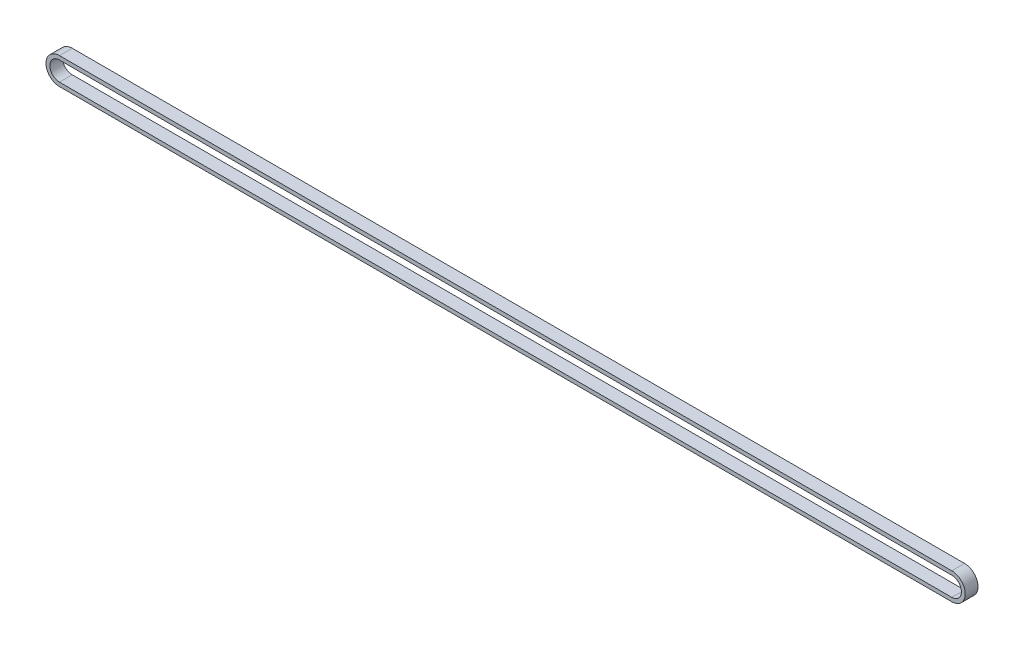
ISO-10303-21;
HEADER;
FILE_DESCRIPTION(('STEP AP214'),'2;1');
FILE_NAME('part.step','',(''),(''),'','','');
FILE_SCHEMA(('AUTOMOTIVE_DESIGN { 1 0 10303 214 1 1 1 1 }'));
ENDSEC;
DATA;
#1=APPLICATION_CONTEXT('core data for automotive mechanical design processes');
#2=APPLICATION_PROTOCOL_DEFINITION('international standard','automotive_design',2000,#1);
#3=PRODUCT_CONTEXT('',#1,'mechanical');
#4=PRODUCT('Part','Part','',(#3));
#5=PRODUCT_RELATED_PRODUCT_CATEGORY('part','',(#4));
#6=PRODUCT_DEFINITION_FORMATION('','',#4);
#7=PRODUCT_DEFINITION_CONTEXT('part definition',#1,'design');
#8=PRODUCT_DEFINITION('design','',#6,#7);
#9=PRODUCT_DEFINITION_SHAPE('','',#8);
#10=(LENGTH_UNIT() NAMED_UNIT(*) SI_UNIT(.MILLI.,.METRE.));
#11=(NAMED_UNIT(*) PLANE_ANGLE_UNIT() SI_UNIT($,.RADIAN.));
#12=(NAMED_UNIT(*) SI_UNIT($,.STERADIAN.) SOLID_ANGLE_UNIT());
#13=UNCERTAINTY_MEASURE_WITH_UNIT(LENGTH_MEASURE(1.E-05),#10,'distance_accuracy_value','');
#14=(GEOMETRIC_REPRESENTATION_CONTEXT(3) GLOBAL_UNCERTAINTY_ASSIGNED_CONTEXT((#13)) GLOBAL_UNIT_ASSIGNED_CONTEXT((#10,
#11,#12)) REPRESENTATION_CONTEXT('',''));
#15=CARTESIAN_POINT('',(0.,0.,0.));
#16=DIRECTION('',(0.,0.,1.));
#17=DIRECTION('',(1.,0.,0.));
#18=AXIS2_PLACEMENT_3D('',#15,#16,#17);
#19=CARTESIAN_POINT('',(-209.565,0.,6.));
#20=DIRECTION('',(0.,0.,1.));
#21=DIRECTION('',(1.,0.,0.));
#22=AXIS2_PLACEMENT_3D('',#19,#20,#21);
#23=PLANE('',#22);
#24=CARTESIAN_POINT('',(-209.565,0.,6.));
#25=DIRECTION('',(0.,0.,1.));
#26=DIRECTION('',(1.,0.,0.));
#27=AXIS2_PLACEMENT_3D('',#24,#25,#26);
#28=CIRCLE('',#27,6.3);
#29=CARTESIAN_POINT('',(-209.565,6.3,6.));
#30=VERTEX_POINT('',#29);
#31=CARTESIAN_POINT('',(-209.565,-6.3,6.));
#32=VERTEX_POINT('',#31);
#33=EDGE_CURVE('E164',#30,#32,#28,.T.);
#34=ORIENTED_EDGE('',*,*,#33,.T.);
#35=DIRECTION('',(1.,0.,0.));
#36=VECTOR('',#35,1.);
#37=CARTESIAN_POINT('',(-209.565,-6.3,6.));
#38=LINE('',#37,#36);
#39=CARTESIAN_POINT('',(209.565,-6.29999999999992,6.));
#40=VERTEX_POINT('',#39);
#41=EDGE_CURVE('E167',#32,#40,#38,.T.);
#42=ORIENTED_EDGE('',*,*,#41,.T.);
#43=CARTESIAN_POINT('',(209.565,0.,6.));
#44=DIRECTION('',(0.,0.,1.));
#45=DIRECTION('',(1.,0.,0.));
#46=AXIS2_PLACEMENT_3D('',#43,#44,#45);
#47=CIRCLE('',#46,6.3);
#48=CARTESIAN_POINT('',(209.565,6.30000000000008,6.));
#49=VERTEX_POINT('',#48);
#50=EDGE_CURVE('E170',#40,#49,#47,.T.);
#51=ORIENTED_EDGE('',*,*,#50,.T.);
#52=DIRECTION('',(-1.,0.,0.));
#53=VECTOR('',#52,1.);
#54=CARTESIAN_POINT('',(-209.565,6.3,6.));
#55=LINE('',#54,#53);
#56=EDGE_CURVE('E172',#49,#30,#55,.T.);
#57=ORIENTED_EDGE('',*,*,#56,.T.);
#58=EDGE_LOOP('',(#34,#42,#51,#57));
#59=FACE_BOUND('',#58,.T.);
#60=DIRECTION('',(1.,0.,0.));
#61=VECTOR('',#60,1.);
#62=CARTESIAN_POINT('',(-209.565,-4.5,6.));
#63=LINE('',#62,#61);
#64=CARTESIAN_POINT('',(-209.565,-4.5,6.));
#65=VERTEX_POINT('',#64);
#66=CARTESIAN_POINT('',(209.565,-4.49999999999992,6.));
#67=VERTEX_POINT('',#66);
#68=EDGE_CURVE('E136',#65,#67,#63,.T.);
#69=ORIENTED_EDGE('',*,*,#68,.F.);
#70=CARTESIAN_POINT('',(-209.565,0.,6.));
#71=DIRECTION('',(0.,0.,1.));
#72=DIRECTION('',(1.,0.,0.));
#73=AXIS2_PLACEMENT_3D('',#70,#71,#72);
#74=CIRCLE('',#73,4.5);
#75=CARTESIAN_POINT('',(-209.565,4.5,6.));
#76=VERTEX_POINT('',#75);
#77=EDGE_CURVE('E128',#76,#65,#74,.T.);
#78=ORIENTED_EDGE('',*,*,#77,.F.);
#79=DIRECTION('',(-1.,0.,0.));
#80=VECTOR('',#79,1.);
#81=CARTESIAN_POINT('',(-209.565,4.5,6.));
#82=LINE('',#81,#80);
#83=CARTESIAN_POINT('',(209.565,4.50000000000008,6.));
#84=VERTEX_POINT('',#83);
#85=EDGE_CURVE('E150',#84,#76,#82,.T.);
#86=ORIENTED_EDGE('',*,*,#85,.F.);
#87=CARTESIAN_POINT('',(209.565,0.,6.));
#88=DIRECTION('',(0.,0.,1.));
#89=DIRECTION('',(1.,0.,0.));
#90=AXIS2_PLACEMENT_3D('',#87,#88,#89);
#91=CIRCLE('',#90,4.5);
#92=EDGE_CURVE('E148',#67,#84,#91,.T.);
#93=ORIENTED_EDGE('',*,*,#92,.F.);
#94=EDGE_LOOP('',(#69,#78,#86,#93));
#95=FACE_BOUND('',#94,.T.);
#96=ADVANCED_FACE('F63',(#59,#95),#23,.T.);
#97=CARTESIAN_POINT('',(-209.565,0.,0.));
#98=DIRECTION('',(0.,0.,1.));
#99=DIRECTION('',(1.,0.,0.));
#100=AXIS2_PLACEMENT_3D('',#97,#98,#99);
#101=PLANE('',#100);
#102=CARTESIAN_POINT('',(-209.565,0.,0.));
#103=DIRECTION('',(0.,0.,1.));
#104=DIRECTION('',(1.,0.,0.));
#105=AXIS2_PLACEMENT_3D('',#102,#103,#104);
#106=CIRCLE('',#105,6.3);
#107=CARTESIAN_POINT('',(-209.565,6.3,0.));
#108=VERTEX_POINT('',#107);
#109=CARTESIAN_POINT('',(-209.565,-6.3,0.));
#110=VERTEX_POINT('',#109);
#111=EDGE_CURVE('E144',#108,#110,#106,.T.);
#112=ORIENTED_EDGE('',*,*,#111,.F.);
#113=DIRECTION('',(-1.,0.,0.));
#114=VECTOR('',#113,1.);
#115=CARTESIAN_POINT('',(-209.565,6.3,0.));
#116=LINE('',#115,#114);
#117=CARTESIAN_POINT('',(209.565,6.30000000000008,0.));
#118=VERTEX_POINT('',#117);
#119=EDGE_CURVE('E168',#118,#108,#116,.T.);
#120=ORIENTED_EDGE('',*,*,#119,.F.);
#121=CARTESIAN_POINT('',(209.565,0.,0.));
#122=DIRECTION('',(0.,0.,1.));
#123=DIRECTION('',(1.,0.,0.));
#124=AXIS2_PLACEMENT_3D('',#121,#122,#123);
#125=CIRCLE('',#124,6.3);
#126=CARTESIAN_POINT('',(209.565,-6.29999999999992,0.));
#127=VERTEX_POINT('',#126);
#128=EDGE_CURVE('E179',#127,#118,#125,.T.);
#129=ORIENTED_EDGE('',*,*,#128,.F.);
#130=DIRECTION('',(1.,0.,0.));
#131=VECTOR('',#130,1.);
#132=CARTESIAN_POINT('',(-209.565,-6.3,0.));
#133=LINE('',#132,#131);
#134=EDGE_CURVE('E177',#110,#127,#133,.T.);
#135=ORIENTED_EDGE('',*,*,#134,.F.);
#136=EDGE_LOOP('',(#112,#120,#129,#135));
#137=FACE_BOUND('',#136,.T.);
#138=CARTESIAN_POINT('',(-209.565,0.,0.));
#139=DIRECTION('',(0.,0.,1.));
#140=DIRECTION('',(1.,0.,0.));
#141=AXIS2_PLACEMENT_3D('',#138,#139,#140);
#142=CIRCLE('',#141,4.5);
#143=CARTESIAN_POINT('',(-209.565,4.5,0.));
#144=VERTEX_POINT('',#143);
#145=CARTESIAN_POINT('',(-209.565,-4.5,0.));
#146=VERTEX_POINT('',#145);
#147=EDGE_CURVE('E86',#144,#146,#142,.T.);
#148=ORIENTED_EDGE('',*,*,#147,.T.);
#149=DIRECTION('',(1.,0.,0.));
#150=VECTOR('',#149,1.);
#151=CARTESIAN_POINT('',(-209.565,-4.5,0.));
#152=LINE('',#151,#150);
#153=CARTESIAN_POINT('',(209.565,-4.49999999999992,0.));
#154=VERTEX_POINT('',#153);
#155=EDGE_CURVE('E143',#146,#154,#152,.T.);
#156=ORIENTED_EDGE('',*,*,#155,.T.);
#157=CARTESIAN_POINT('',(209.565,0.,0.));
#158=DIRECTION('',(0.,0.,1.));
#159=DIRECTION('',(1.,0.,0.));
#160=AXIS2_PLACEMENT_3D('',#157,#158,#159);
#161=CIRCLE('',#160,4.5);
#162=CARTESIAN_POINT('',(209.565,4.50000000000008,0.));
#163=VERTEX_POINT('',#162);
#164=EDGE_CURVE('E156',#154,#163,#161,.T.);
#165=ORIENTED_EDGE('',*,*,#164,.T.);
#166=DIRECTION('',(-1.,0.,0.));
#167=VECTOR('',#166,1.);
#168=CARTESIAN_POINT('',(-209.565,4.5,0.));
#169=LINE('',#168,#167);
#170=EDGE_CURVE('E137',#163,#144,#169,.T.);
#171=ORIENTED_EDGE('',*,*,#170,.T.);
#172=EDGE_LOOP('',(#148,#156,#165,#171));
#173=FACE_BOUND('',#172,.T.);
#174=ADVANCED_FACE('F197',(#137,#173),#101,.F.);
#175=CARTESIAN_POINT('',(-209.565,0.,6.));
#176=DIRECTION('',(0.,0.,-1.));
#177=DIRECTION('',(-1.,0.,0.));
#178=AXIS2_PLACEMENT_3D('',#175,#176,#177);
#179=CYLINDRICAL_SURFACE('',#178,6.3);
#180=ORIENTED_EDGE('',*,*,#111,.T.);
#181=DIRECTION('',(0.,0.,-1.));
#182=VECTOR('',#181,1.);
#183=CARTESIAN_POINT('',(-209.565,-6.3,6.));
#184=LINE('',#183,#182);
#185=EDGE_CURVE('E12',#32,#110,#184,.T.);
#186=ORIENTED_EDGE('',*,*,#185,.F.);
#187=ORIENTED_EDGE('',*,*,#33,.F.);
#188=DIRECTION('',(0.,0.,-1.));
#189=VECTOR('',#188,1.);
#190=CARTESIAN_POINT('',(-209.565,6.3,6.));
#191=LINE('',#190,#189);
#192=EDGE_CURVE('E174',#30,#108,#191,.T.);
#193=ORIENTED_EDGE('',*,*,#192,.T.);
#194=EDGE_LOOP('',(#180,#186,#187,#193));
#195=FACE_BOUND('',#194,.T.);
#196=ADVANCED_FACE('F65',(#195),#179,.T.);
#197=CARTESIAN_POINT('',(-209.565,-6.3,6.));
#198=DIRECTION('',(0.,1.,0.));
#199=DIRECTION('',(-1.,0.,0.));
#200=AXIS2_PLACEMENT_3D('',#197,#198,#199);
#201=PLANE('',#200);
#202=ORIENTED_EDGE('',*,*,#134,.T.);
#203=DIRECTION('',(0.,0.,-1.));
#204=VECTOR('',#203,1.);
#205=CARTESIAN_POINT('',(209.565,-6.29999999999992,6.));
#206=LINE('',#205,#204);
#207=EDGE_CURVE('E71',#40,#127,#206,.T.);
#208=ORIENTED_EDGE('',*,*,#207,.F.);
#209=ORIENTED_EDGE('',*,*,#41,.F.);
#210=ORIENTED_EDGE('',*,*,#185,.T.);
#211=EDGE_LOOP('',(#202,#208,#209,#210));
#212=FACE_BOUND('',#211,.T.);
#213=ADVANCED_FACE('F207',(#212),#201,.F.);
#214=CARTESIAN_POINT('',(209.565,0.,6.));
#215=DIRECTION('',(0.,0.,-1.));
#216=DIRECTION('',(-1.,0.,0.));
#217=AXIS2_PLACEMENT_3D('',#214,#215,#216);
#218=CYLINDRICAL_SURFACE('',#217,6.3);
#219=ORIENTED_EDGE('',*,*,#128,.T.);
#220=DIRECTION('',(0.,0.,-1.));
#221=VECTOR('',#220,1.);
#222=CARTESIAN_POINT('',(209.565,6.30000000000008,6.));
#223=LINE('',#222,#221);
#224=EDGE_CURVE('E184',#49,#118,#223,.T.);
#225=ORIENTED_EDGE('',*,*,#224,.F.);
#226=ORIENTED_EDGE('',*,*,#50,.F.);
#227=ORIENTED_EDGE('',*,*,#207,.T.);
#228=EDGE_LOOP('',(#219,#225,#226,#227));
#229=FACE_BOUND('',#228,.T.);
#230=ADVANCED_FACE('F191',(#229),#218,.T.);
#231=CARTESIAN_POINT('',(-209.565,6.3,6.));
#232=DIRECTION('',(0.,-1.,0.));
#233=DIRECTION('',(1.,0.,0.));
#234=AXIS2_PLACEMENT_3D('',#231,#232,#233);
#235=PLANE('',#234);
#236=ORIENTED_EDGE('',*,*,#119,.T.);
#237=ORIENTED_EDGE('',*,*,#192,.F.);
#238=ORIENTED_EDGE('',*,*,#56,.F.);
#239=ORIENTED_EDGE('',*,*,#224,.T.);
#240=EDGE_LOOP('',(#236,#237,#238,#239));
#241=FACE_BOUND('',#240,.T.);
#242=ADVANCED_FACE('F201',(#241),#235,.F.);
#243=CARTESIAN_POINT('',(-209.565,0.,6.));
#244=DIRECTION('',(0.,0.,-1.));
#245=DIRECTION('',(-1.,0.,0.));
#246=AXIS2_PLACEMENT_3D('',#243,#244,#245);
#247=CYLINDRICAL_SURFACE('',#246,4.5);
#248=ORIENTED_EDGE('',*,*,#147,.F.);
#249=DIRECTION('',(0.,0.,-1.));
#250=VECTOR('',#249,1.);
#251=CARTESIAN_POINT('',(-209.565,4.5,6.));
#252=LINE('',#251,#250);
#253=EDGE_CURVE('E132',#76,#144,#252,.T.);
#254=ORIENTED_EDGE('',*,*,#253,.F.);
#255=ORIENTED_EDGE('',*,*,#77,.T.);
#256=DIRECTION('',(0.,0.,-1.));
#257=VECTOR('',#256,1.);
#258=CARTESIAN_POINT('',(-209.565,-4.5,6.));
#259=LINE('',#258,#257);
#260=EDGE_CURVE('E131',#65,#146,#259,.T.);
#261=ORIENTED_EDGE('',*,*,#260,.T.);
#262=EDGE_LOOP('',(#248,#254,#255,#261));
#263=FACE_BOUND('',#262,.T.);
#264=ADVANCED_FACE('F130',(#263),#247,.F.);
#265=CARTESIAN_POINT('',(-209.565,-4.5,6.));
#266=DIRECTION('',(0.,1.,0.));
#267=DIRECTION('',(-1.,0.,0.));
#268=AXIS2_PLACEMENT_3D('',#265,#266,#267);
#269=PLANE('',#268);
#270=ORIENTED_EDGE('',*,*,#155,.F.);
#271=ORIENTED_EDGE('',*,*,#260,.F.);
#272=ORIENTED_EDGE('',*,*,#68,.T.);
#273=DIRECTION('',(0.,0.,-1.));
#274=VECTOR('',#273,1.);
#275=CARTESIAN_POINT('',(209.565,-4.49999999999992,6.));
#276=LINE('',#275,#274);
#277=EDGE_CURVE('E145',#67,#154,#276,.T.);
#278=ORIENTED_EDGE('',*,*,#277,.T.);
#279=EDGE_LOOP('',(#270,#271,#272,#278));
#280=FACE_BOUND('',#279,.T.);
#281=ADVANCED_FACE('F140',(#280),#269,.T.);
#282=CARTESIAN_POINT('',(209.565,0.,6.));
#283=DIRECTION('',(0.,0.,-1.));
#284=DIRECTION('',(-1.,0.,0.));
#285=AXIS2_PLACEMENT_3D('',#282,#283,#284);
#286=CYLINDRICAL_SURFACE('',#285,4.5);
#287=ORIENTED_EDGE('',*,*,#164,.F.);
#288=ORIENTED_EDGE('',*,*,#277,.F.);
#289=ORIENTED_EDGE('',*,*,#92,.T.);
#290=DIRECTION('',(0.,0.,-1.));
#291=VECTOR('',#290,1.);
#292=CARTESIAN_POINT('',(209.565,4.50000000000008,6.));
#293=LINE('',#292,#291);
#294=EDGE_CURVE('E78',#84,#163,#293,.T.);
#295=ORIENTED_EDGE('',*,*,#294,.T.);
#296=EDGE_LOOP('',(#287,#288,#289,#295));
#297=FACE_BOUND('',#296,.T.);
#298=ADVANCED_FACE('F230',(#297),#286,.F.);
#299=CARTESIAN_POINT('',(-209.565,4.5,6.));
#300=DIRECTION('',(0.,-1.,0.));
#301=DIRECTION('',(1.,0.,0.));
#302=AXIS2_PLACEMENT_3D('',#299,#300,#301);
#303=PLANE('',#302);
#304=ORIENTED_EDGE('',*,*,#170,.F.);
#305=ORIENTED_EDGE('',*,*,#294,.F.);
#306=ORIENTED_EDGE('',*,*,#85,.T.);
#307=ORIENTED_EDGE('',*,*,#253,.T.);
#308=EDGE_LOOP('',(#304,#305,#306,#307));
#309=FACE_BOUND('',#308,.T.);
#310=ADVANCED_FACE('F234',(#309),#303,.T.);
#311=CLOSED_SHELL('',(#96,#174,#196,#213,#230,#242,#264,#281,#298,#310));
#312=MANIFOLD_SOLID_BREP('B2',#311);
#313=ADVANCED_BREP_SHAPE_REPRESENTATION('',(#18,#312),#14);
#314=SHAPE_DEFINITION_REPRESENTATION(#9,#313);
ENDSEC;
END-ISO-10303-21;
